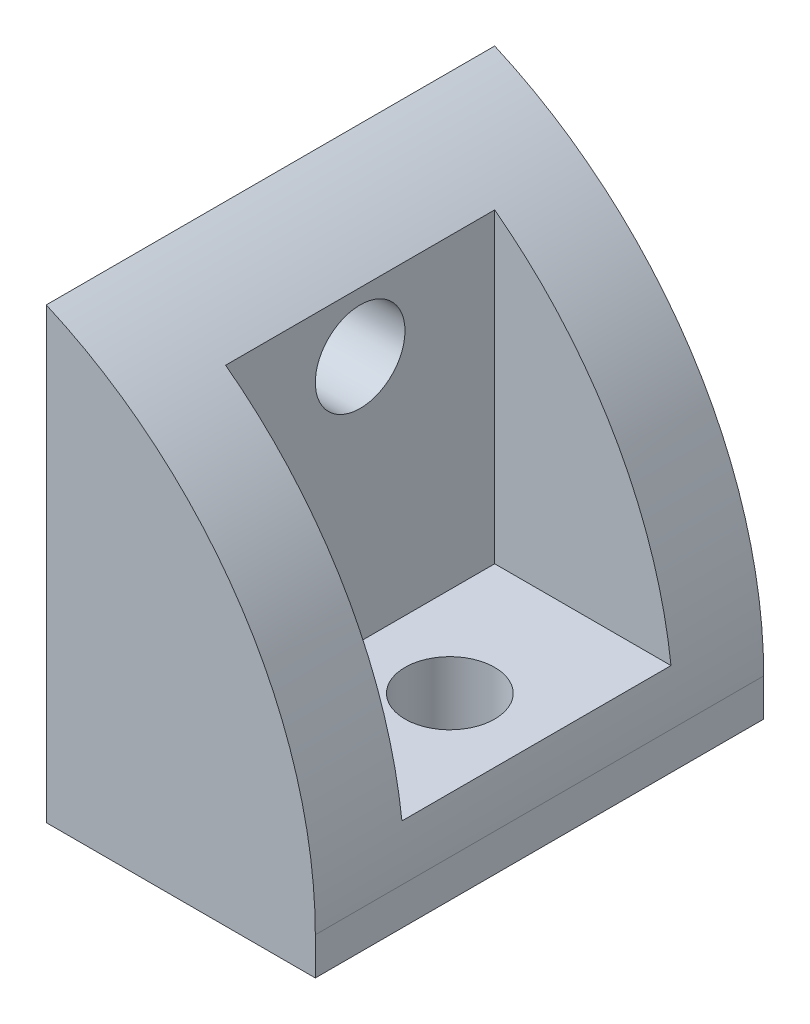
ISO-10303-21;
HEADER;
FILE_DESCRIPTION(('STEP AP214'),'2;1');
FILE_NAME('part.step','',(''),(''),'','','');
FILE_SCHEMA(('AUTOMOTIVE_DESIGN { 1 0 10303 214 1 1 1 1 }'));
ENDSEC;
DATA;
#1=APPLICATION_CONTEXT('core data for automotive mechanical design processes');
#2=APPLICATION_PROTOCOL_DEFINITION('international standard','automotive_design',2000,#1);
#3=PRODUCT_CONTEXT('',#1,'mechanical');
#4=PRODUCT('Part','Part','',(#3));
#5=PRODUCT_RELATED_PRODUCT_CATEGORY('part','',(#4));
#6=PRODUCT_DEFINITION_FORMATION('','',#4);
#7=PRODUCT_DEFINITION_CONTEXT('part definition',#1,'design');
#8=PRODUCT_DEFINITION('design','',#6,#7);
#9=PRODUCT_DEFINITION_SHAPE('','',#8);
#10=(LENGTH_UNIT() NAMED_UNIT(*) SI_UNIT(.MILLI.,.METRE.));
#11=(NAMED_UNIT(*) PLANE_ANGLE_UNIT() SI_UNIT($,.RADIAN.));
#12=(NAMED_UNIT(*) SI_UNIT($,.STERADIAN.) SOLID_ANGLE_UNIT());
#13=UNCERTAINTY_MEASURE_WITH_UNIT(LENGTH_MEASURE(1.E-05),#10,'distance_accuracy_value','');
#14=(GEOMETRIC_REPRESENTATION_CONTEXT(3) GLOBAL_UNCERTAINTY_ASSIGNED_CONTEXT((#13)) GLOBAL_UNIT_ASSIGNED_CONTEXT((#10,
#11,#12)) REPRESENTATION_CONTEXT('',''));
#15=CARTESIAN_POINT('',(0.,0.,0.));
#16=DIRECTION('',(0.,0.,1.));
#17=DIRECTION('',(1.,0.,0.));
#18=AXIS2_PLACEMENT_3D('',#15,#16,#17);
#19=CARTESIAN_POINT('',(6.,-2.,0.));
#20=DIRECTION('',(1.,0.,0.));
#21=DIRECTION('',(0.,0.,-1.));
#22=AXIS2_PLACEMENT_3D('',#19,#20,#21);
#23=PLANE('',#22);
#24=DIRECTION('',(0.,1.,0.));
#25=VECTOR('',#24,1.);
#26=CARTESIAN_POINT('',(6.,-2.,-10.));
#27=LINE('',#26,#25);
#28=CARTESIAN_POINT('',(6.,-2.,-10.));
#29=VERTEX_POINT('',#28);
#30=CARTESIAN_POINT('',(6.,-1.16515138991168,-10.));
#31=VERTEX_POINT('',#30);
#32=EDGE_CURVE('E129',#29,#31,#27,.T.);
#33=ORIENTED_EDGE('',*,*,#32,.T.);
#34=DIRECTION('',(0.,0.,1.));
#35=VECTOR('',#34,1.);
#36=CARTESIAN_POINT('',(6.,-1.16515138991168,0.));
#37=LINE('',#36,#35);
#38=CARTESIAN_POINT('',(6.,-1.16515138991168,0.));
#39=VERTEX_POINT('',#38);
#40=EDGE_CURVE('E44',#31,#39,#37,.T.);
#41=ORIENTED_EDGE('',*,*,#40,.T.);
#42=DIRECTION('',(0.,1.,0.));
#43=VECTOR('',#42,1.);
#44=CARTESIAN_POINT('',(6.,-2.,0.));
#45=LINE('',#44,#43);
#46=CARTESIAN_POINT('',(6.,-2.,0.));
#47=VERTEX_POINT('',#46);
#48=EDGE_CURVE('E132',#47,#39,#45,.T.);
#49=ORIENTED_EDGE('',*,*,#48,.F.);
#50=DIRECTION('',(0.,0.,-1.));
#51=VECTOR('',#50,1.);
#52=CARTESIAN_POINT('',(6.,-2.,0.));
#53=LINE('',#52,#51);
#54=EDGE_CURVE('E114',#47,#29,#53,.T.);
#55=ORIENTED_EDGE('',*,*,#54,.T.);
#56=EDGE_LOOP('',(#33,#41,#49,#55));
#57=FACE_BOUND('',#56,.T.);
#58=ADVANCED_FACE('F34',(#57),#23,.T.);
#59=CARTESIAN_POINT('',(0.,-2.,0.));
#60=DIRECTION('',(0.,0.,1.));
#61=DIRECTION('',(1.,0.,0.));
#62=AXIS2_PLACEMENT_3D('',#59,#60,#61);
#63=PLANE('',#62);
#64=ORIENTED_EDGE('',*,*,#48,.T.);
#65=CARTESIAN_POINT('',(-4.,-1.16515138991168,0.));
#66=DIRECTION('',(0.,0.,1.));
#67=DIRECTION('',(1.,0.,0.));
#68=AXIS2_PLACEMENT_3D('',#65,#66,#67);
#69=CIRCLE('',#68,10.);
#70=CARTESIAN_POINT('',(0.,8.,0.));
#71=VERTEX_POINT('',#70);
#72=EDGE_CURVE('E11',#39,#71,#69,.T.);
#73=ORIENTED_EDGE('',*,*,#72,.T.);
#74=DIRECTION('',(0.,1.,0.));
#75=VECTOR('',#74,1.);
#76=CARTESIAN_POINT('',(0.,-2.,0.));
#77=LINE('',#76,#75);
#78=CARTESIAN_POINT('',(0.,-2.,0.));
#79=VERTEX_POINT('',#78);
#80=EDGE_CURVE('E135',#79,#71,#77,.T.);
#81=ORIENTED_EDGE('',*,*,#80,.F.);
#82=DIRECTION('',(1.,0.,0.));
#83=VECTOR('',#82,1.);
#84=CARTESIAN_POINT('',(0.,-2.,0.));
#85=LINE('',#84,#83);
#86=EDGE_CURVE('E123',#79,#47,#85,.T.);
#87=ORIENTED_EDGE('',*,*,#86,.T.);
#88=EDGE_LOOP('',(#64,#73,#81,#87));
#89=FACE_BOUND('',#88,.T.);
#90=ADVANCED_FACE('F185',(#89),#63,.T.);
#91=CARTESIAN_POINT('',(0.,-2.,0.));
#92=DIRECTION('',(1.,0.,0.));
#93=DIRECTION('',(0.,0.,-1.));
#94=AXIS2_PLACEMENT_3D('',#91,#92,#93);
#95=PLANE('',#94);
#96=CARTESIAN_POINT('',(0.,5.5,-5.));
#97=DIRECTION('',(1.,0.,0.));
#98=DIRECTION('',(0.,0.,-1.));
#99=AXIS2_PLACEMENT_3D('',#96,#97,#98);
#100=CIRCLE('',#99,1.);
#101=CARTESIAN_POINT('',(0.,5.5,-6.));
#102=VERTEX_POINT('',#101);
#103=EDGE_CURVE('E155',#102,#102,#100,.T.);
#104=ORIENTED_EDGE('',*,*,#103,.T.);
#105=EDGE_LOOP('',(#104));
#106=FACE_BOUND('',#105,.T.);
#107=ORIENTED_EDGE('',*,*,#80,.T.);
#108=DIRECTION('',(0.,0.,-1.));
#109=VECTOR('',#108,1.);
#110=CARTESIAN_POINT('',(0.,8.,0.));
#111=LINE('',#110,#109);
#112=CARTESIAN_POINT('',(0.,8.,-10.));
#113=VERTEX_POINT('',#112);
#114=EDGE_CURVE('E92',#71,#113,#111,.T.);
#115=ORIENTED_EDGE('',*,*,#114,.T.);
#116=DIRECTION('',(0.,1.,0.));
#117=VECTOR('',#116,1.);
#118=CARTESIAN_POINT('',(0.,-2.,-10.));
#119=LINE('',#118,#117);
#120=CARTESIAN_POINT('',(0.,-2.,-10.));
#121=VERTEX_POINT('',#120);
#122=EDGE_CURVE('E138',#121,#113,#119,.T.);
#123=ORIENTED_EDGE('',*,*,#122,.F.);
#124=DIRECTION('',(0.,0.,-1.));
#125=VECTOR('',#124,1.);
#126=CARTESIAN_POINT('',(0.,-2.,0.));
#127=LINE('',#126,#125);
#128=EDGE_CURVE('E120',#79,#121,#127,.T.);
#129=ORIENTED_EDGE('',*,*,#128,.F.);
#130=EDGE_LOOP('',(#107,#115,#123,#129));
#131=FACE_BOUND('',#130,.T.);
#132=ADVANCED_FACE('F164',(#106,#131),#95,.F.);
#133=CARTESIAN_POINT('',(0.,-2.,-10.));
#134=DIRECTION('',(0.,0.,1.));
#135=DIRECTION('',(1.,0.,0.));
#136=AXIS2_PLACEMENT_3D('',#133,#134,#135);
#137=PLANE('',#136);
#138=ORIENTED_EDGE('',*,*,#122,.T.);
#139=CARTESIAN_POINT('',(-4.,-1.16515138991168,-10.));
#140=DIRECTION('',(0.,0.,1.));
#141=DIRECTION('',(1.,0.,0.));
#142=AXIS2_PLACEMENT_3D('',#139,#140,#141);
#143=CIRCLE('',#142,10.);
#144=EDGE_CURVE('E134',#113,#31,#143,.F.);
#145=ORIENTED_EDGE('',*,*,#144,.T.);
#146=ORIENTED_EDGE('',*,*,#32,.F.);
#147=DIRECTION('',(1.,0.,0.));
#148=VECTOR('',#147,1.);
#149=CARTESIAN_POINT('',(0.,-2.,-10.));
#150=LINE('',#149,#148);
#151=EDGE_CURVE('E117',#121,#29,#150,.T.);
#152=ORIENTED_EDGE('',*,*,#151,.F.);
#153=EDGE_LOOP('',(#138,#145,#146,#152));
#154=FACE_BOUND('',#153,.T.);
#155=ADVANCED_FACE('F192',(#154),#137,.F.);
#156=CARTESIAN_POINT('',(4.,-2.,-5.));
#157=DIRECTION('',(0.,1.,0.));
#158=DIRECTION('',(0.,0.,1.));
#159=AXIS2_PLACEMENT_3D('',#156,#157,#158);
#160=CYLINDRICAL_SURFACE('',#159,1.);
#161=CARTESIAN_POINT('',(4.,-2.,-5.));
#162=DIRECTION('',(0.,1.,0.));
#163=DIRECTION('',(0.,0.,1.));
#164=AXIS2_PLACEMENT_3D('',#161,#162,#163);
#165=CIRCLE('',#164,1.);
#166=CARTESIAN_POINT('',(4.,-2.,-4.));
#167=VERTEX_POINT('',#166);
#168=EDGE_CURVE('E126',#167,#167,#165,.T.);
#169=ORIENTED_EDGE('',*,*,#168,.F.);
#170=EDGE_LOOP('',(#169));
#171=FACE_BOUND('',#170,.T.);
#172=CARTESIAN_POINT('',(4.,0.,-5.));
#173=DIRECTION('',(0.,1.,0.));
#174=DIRECTION('',(0.,0.,1.));
#175=AXIS2_PLACEMENT_3D('',#172,#173,#174);
#176=CIRCLE('',#175,1.);
#177=CARTESIAN_POINT('',(4.,0.,-4.));
#178=VERTEX_POINT('',#177);
#179=EDGE_CURVE('E107',#178,#178,#176,.T.);
#180=ORIENTED_EDGE('',*,*,#179,.T.);
#181=EDGE_LOOP('',(#180));
#182=FACE_BOUND('',#181,.T.);
#183=ADVANCED_FACE('F195',(#171,#182),#160,.F.);
#184=CARTESIAN_POINT('',(0.,-2.,0.));
#185=DIRECTION('',(0.,1.,0.));
#186=DIRECTION('',(0.,0.,1.));
#187=AXIS2_PLACEMENT_3D('',#184,#185,#186);
#188=PLANE('',#187);
#189=ORIENTED_EDGE('',*,*,#54,.F.);
#190=ORIENTED_EDGE('',*,*,#86,.F.);
#191=ORIENTED_EDGE('',*,*,#128,.T.);
#192=ORIENTED_EDGE('',*,*,#151,.T.);
#193=EDGE_LOOP('',(#189,#190,#191,#192));
#194=FACE_BOUND('',#193,.T.);
#195=ORIENTED_EDGE('',*,*,#168,.T.);
#196=EDGE_LOOP('',(#195));
#197=FACE_BOUND('',#196,.T.);
#198=ADVANCED_FACE('F181',(#194,#197),#188,.F.);
#199=CARTESIAN_POINT('',(0.,0.,0.));
#200=DIRECTION('',(0.,1.,0.));
#201=DIRECTION('',(0.,0.,1.));
#202=AXIS2_PLACEMENT_3D('',#199,#200,#201);
#203=PLANE('',#202);
#204=DIRECTION('',(-1.,0.,0.));
#205=VECTOR('',#204,1.);
#206=CARTESIAN_POINT('',(0.,0.,-2.));
#207=LINE('',#206,#205);
#208=CARTESIAN_POINT('',(5.93188915758663,0.,-2.));
#209=VERTEX_POINT('',#208);
#210=CARTESIAN_POINT('',(2.,0.,-2.));
#211=VERTEX_POINT('',#210);
#212=EDGE_CURVE('E100',#209,#211,#207,.T.);
#213=ORIENTED_EDGE('',*,*,#212,.F.);
#214=DIRECTION('',(0.,0.,-1.));
#215=VECTOR('',#214,1.);
#216=CARTESIAN_POINT('',(5.93188915758663,0.,-5.));
#217=LINE('',#216,#215);
#218=CARTESIAN_POINT('',(5.93188915758663,0.,-8.));
#219=VERTEX_POINT('',#218);
#220=EDGE_CURVE('E105',#209,#219,#217,.T.);
#221=ORIENTED_EDGE('',*,*,#220,.T.);
#222=DIRECTION('',(1.,0.,0.));
#223=VECTOR('',#222,1.);
#224=CARTESIAN_POINT('',(0.,0.,-8.));
#225=LINE('',#224,#223);
#226=CARTESIAN_POINT('',(2.,0.,-8.));
#227=VERTEX_POINT('',#226);
#228=EDGE_CURVE('E151',#227,#219,#225,.T.);
#229=ORIENTED_EDGE('',*,*,#228,.F.);
#230=DIRECTION('',(0.,0.,-1.));
#231=VECTOR('',#230,1.);
#232=CARTESIAN_POINT('',(2.,0.,0.));
#233=LINE('',#232,#231);
#234=EDGE_CURVE('E104',#211,#227,#233,.T.);
#235=ORIENTED_EDGE('',*,*,#234,.F.);
#236=EDGE_LOOP('',(#213,#221,#229,#235));
#237=FACE_BOUND('',#236,.T.);
#238=ORIENTED_EDGE('',*,*,#179,.F.);
#239=EDGE_LOOP('',(#238));
#240=FACE_BOUND('',#239,.T.);
#241=ADVANCED_FACE('F174',(#237,#240),#203,.T.);
#242=CARTESIAN_POINT('',(2.,8.,0.));
#243=DIRECTION('',(-1.,0.,0.));
#244=DIRECTION('',(0.,0.,1.));
#245=AXIS2_PLACEMENT_3D('',#242,#243,#244);
#246=PLANE('',#245);
#247=CARTESIAN_POINT('',(2.,5.5,-5.));
#248=DIRECTION('',(1.,0.,0.));
#249=DIRECTION('',(0.,0.,-1.));
#250=AXIS2_PLACEMENT_3D('',#247,#248,#249);
#251=CIRCLE('',#250,1.);
#252=CARTESIAN_POINT('',(2.,5.5,-6.));
#253=VERTEX_POINT('',#252);
#254=EDGE_CURVE('E158',#253,#253,#251,.T.);
#255=ORIENTED_EDGE('',*,*,#254,.F.);
#256=EDGE_LOOP('',(#255));
#257=FACE_BOUND('',#256,.T.);
#258=ORIENTED_EDGE('',*,*,#234,.T.);
#259=DIRECTION('',(0.,-1.,0.));
#260=VECTOR('',#259,1.);
#261=CARTESIAN_POINT('',(2.,8.,-8.));
#262=LINE('',#261,#260);
#263=CARTESIAN_POINT('',(2.,6.83484861008832,-8.));
#264=VERTEX_POINT('',#263);
#265=EDGE_CURVE('E89',#264,#227,#262,.T.);
#266=ORIENTED_EDGE('',*,*,#265,.F.);
#267=DIRECTION('',(0.,0.,-1.));
#268=VECTOR('',#267,1.);
#269=CARTESIAN_POINT('',(2.,6.83484861008832,-5.));
#270=LINE('',#269,#268);
#271=CARTESIAN_POINT('',(2.,6.83484861008832,-2.));
#272=VERTEX_POINT('',#271);
#273=EDGE_CURVE('E93',#272,#264,#270,.T.);
#274=ORIENTED_EDGE('',*,*,#273,.F.);
#275=DIRECTION('',(0.,-1.,0.));
#276=VECTOR('',#275,1.);
#277=CARTESIAN_POINT('',(2.,8.,-2.));
#278=LINE('',#277,#276);
#279=EDGE_CURVE('E112',#272,#211,#278,.T.);
#280=ORIENTED_EDGE('',*,*,#279,.T.);
#281=EDGE_LOOP('',(#258,#266,#274,#280));
#282=FACE_BOUND('',#281,.T.);
#283=ADVANCED_FACE('F102',(#257,#282),#246,.F.);
#284=CARTESIAN_POINT('',(0.,8.,-8.));
#285=DIRECTION('',(0.,0.,-1.));
#286=DIRECTION('',(-1.,0.,0.));
#287=AXIS2_PLACEMENT_3D('',#284,#285,#286);
#288=PLANE('',#287);
#289=ORIENTED_EDGE('',*,*,#228,.T.);
#290=CARTESIAN_POINT('',(-4.,-1.16515138991168,-8.));
#291=DIRECTION('',(0.,0.,-1.));
#292=DIRECTION('',(-1.,0.,0.));
#293=AXIS2_PLACEMENT_3D('',#290,#291,#292);
#294=CIRCLE('',#293,10.);
#295=CARTESIAN_POINT('',(3.37209780774486,5.59148785701008,-8.));
#296=VERTEX_POINT('',#295);
#297=EDGE_CURVE('E91',#296,#219,#294,.T.);
#298=ORIENTED_EDGE('',*,*,#297,.F.);
#299=CARTESIAN_POINT('',(-4.,-1.16515138991168,-8.));
#300=DIRECTION('',(0.,0.,-1.));
#301=DIRECTION('',(-1.,0.,0.));
#302=AXIS2_PLACEMENT_3D('',#299,#300,#301);
#303=CIRCLE('',#302,10.);
#304=EDGE_CURVE('E38',#264,#296,#303,.T.);
#305=ORIENTED_EDGE('',*,*,#304,.F.);
#306=ORIENTED_EDGE('',*,*,#265,.T.);
#307=EDGE_LOOP('',(#289,#298,#305,#306));
#308=FACE_BOUND('',#307,.T.);
#309=ADVANCED_FACE('F87',(#308),#288,.F.);
#310=CARTESIAN_POINT('',(0.,8.,-2.));
#311=DIRECTION('',(0.,0.,1.));
#312=DIRECTION('',(1.,0.,0.));
#313=AXIS2_PLACEMENT_3D('',#310,#311,#312);
#314=PLANE('',#313);
#315=ORIENTED_EDGE('',*,*,#212,.T.);
#316=ORIENTED_EDGE('',*,*,#279,.F.);
#317=CARTESIAN_POINT('',(-4.,-1.16515138991168,-2.));
#318=DIRECTION('',(0.,0.,1.));
#319=DIRECTION('',(1.,0.,0.));
#320=AXIS2_PLACEMENT_3D('',#317,#318,#319);
#321=CIRCLE('',#320,10.);
#322=CARTESIAN_POINT('',(3.37209780774486,5.59148785701008,-2.));
#323=VERTEX_POINT('',#322);
#324=EDGE_CURVE('E96',#323,#272,#321,.T.);
#325=ORIENTED_EDGE('',*,*,#324,.F.);
#326=CARTESIAN_POINT('',(-4.,-1.16515138991168,-2.));
#327=DIRECTION('',(0.,0.,1.));
#328=DIRECTION('',(1.,0.,0.));
#329=AXIS2_PLACEMENT_3D('',#326,#327,#328);
#330=CIRCLE('',#329,10.);
#331=EDGE_CURVE('E109',#323,#209,#330,.F.);
#332=ORIENTED_EDGE('',*,*,#331,.T.);
#333=EDGE_LOOP('',(#315,#316,#325,#332));
#334=FACE_BOUND('',#333,.T.);
#335=ADVANCED_FACE('F148',(#334),#314,.F.);
#336=CARTESIAN_POINT('',(0.,5.5,-5.));
#337=DIRECTION('',(1.,0.,0.));
#338=DIRECTION('',(0.,0.,-1.));
#339=AXIS2_PLACEMENT_3D('',#336,#337,#338);
#340=CYLINDRICAL_SURFACE('',#339,1.);
#341=ORIENTED_EDGE('',*,*,#103,.F.);
#342=EDGE_LOOP('',(#341));
#343=FACE_BOUND('',#342,.T.);
#344=ORIENTED_EDGE('',*,*,#254,.T.);
#345=EDGE_LOOP('',(#344));
#346=FACE_BOUND('',#345,.T.);
#347=ADVANCED_FACE('F167',(#343,#346),#340,.F.);
#348=CARTESIAN_POINT('',(-4.,-1.16515138991168,0.));
#349=DIRECTION('',(0.,0.,-1.));
#350=DIRECTION('',(-1.,0.,0.));
#351=AXIS2_PLACEMENT_3D('',#348,#349,#350);
#352=CYLINDRICAL_SURFACE('',#351,10.);
#353=ORIENTED_EDGE('',*,*,#72,.F.);
#354=ORIENTED_EDGE('',*,*,#40,.F.);
#355=ORIENTED_EDGE('',*,*,#144,.F.);
#356=ORIENTED_EDGE('',*,*,#114,.F.);
#357=EDGE_LOOP('',(#353,#354,#355,#356));
#358=FACE_BOUND('',#357,.T.);
#359=ORIENTED_EDGE('',*,*,#273,.T.);
#360=ORIENTED_EDGE('',*,*,#304,.T.);
#361=ORIENTED_EDGE('',*,*,#297,.T.);
#362=ORIENTED_EDGE('',*,*,#220,.F.);
#363=ORIENTED_EDGE('',*,*,#331,.F.);
#364=ORIENTED_EDGE('',*,*,#324,.T.);
#365=EDGE_LOOP('',(#359,#360,#361,#362,#363,#364));
#366=FACE_BOUND('',#365,.T.);
#367=ADVANCED_FACE('F36',(#358,#366),#352,.T.);
#368=CLOSED_SHELL('',(#58,#90,#132,#155,#183,#198,#241,#283,#309,#335,#347,#367));
#369=MANIFOLD_SOLID_BREP('B2',#368);
#370=ADVANCED_BREP_SHAPE_REPRESENTATION('',(#18,#369),#14);
#371=SHAPE_DEFINITION_REPRESENTATION(#9,#370);
ENDSEC;
END-ISO-10303-21;
